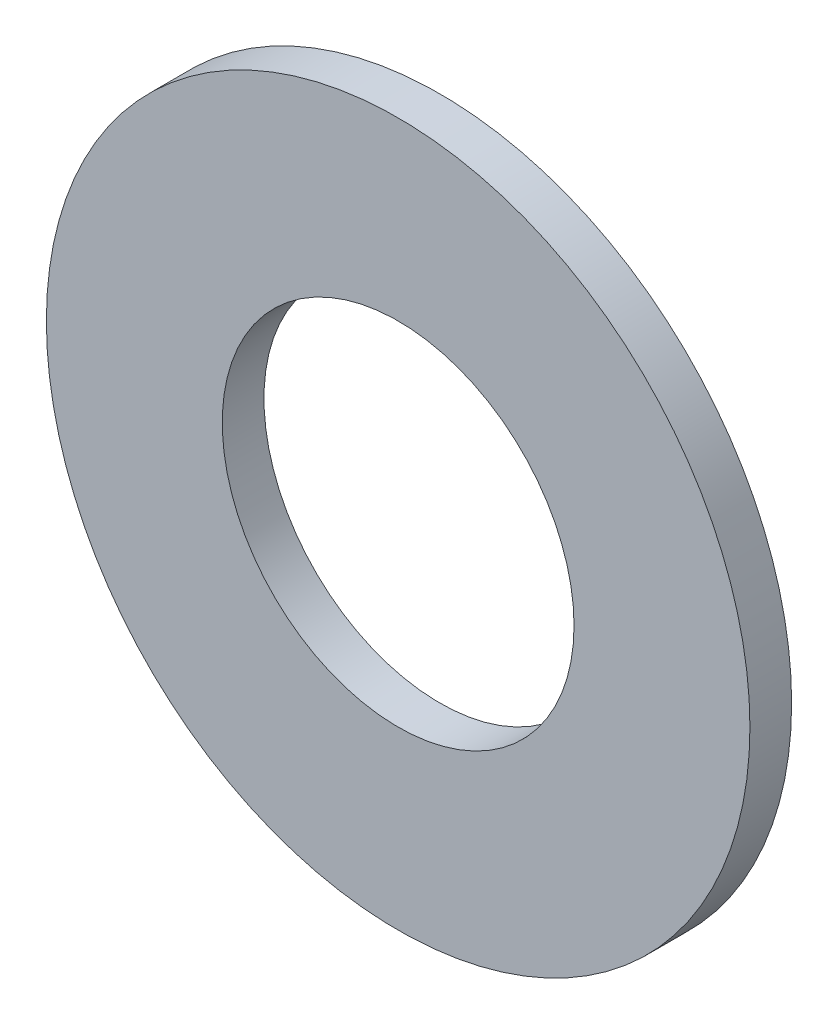
ISO-10303-21;
HEADER;
FILE_DESCRIPTION(('STEP AP214'),'2;1');
FILE_NAME('part.step','',(''),(''),'','','');
FILE_SCHEMA(('AUTOMOTIVE_DESIGN { 1 0 10303 214 1 1 1 1 }'));
ENDSEC;
DATA;
#1=APPLICATION_CONTEXT('core data for automotive mechanical design processes');
#2=APPLICATION_PROTOCOL_DEFINITION('international standard','automotive_design',2000,#1);
#3=PRODUCT_CONTEXT('',#1,'mechanical');
#4=PRODUCT('Part','Part','',(#3));
#5=PRODUCT_RELATED_PRODUCT_CATEGORY('part','',(#4));
#6=PRODUCT_DEFINITION_FORMATION('','',#4);
#7=PRODUCT_DEFINITION_CONTEXT('part definition',#1,'design');
#8=PRODUCT_DEFINITION('design','',#6,#7);
#9=PRODUCT_DEFINITION_SHAPE('','',#8);
#10=(LENGTH_UNIT() NAMED_UNIT(*) SI_UNIT(.MILLI.,.METRE.));
#11=(NAMED_UNIT(*) PLANE_ANGLE_UNIT() SI_UNIT($,.RADIAN.));
#12=(NAMED_UNIT(*) SI_UNIT($,.STERADIAN.) SOLID_ANGLE_UNIT());
#13=UNCERTAINTY_MEASURE_WITH_UNIT(LENGTH_MEASURE(1.E-05),#10,'distance_accuracy_value','');
#14=(GEOMETRIC_REPRESENTATION_CONTEXT(3) GLOBAL_UNCERTAINTY_ASSIGNED_CONTEXT((#13)) GLOBAL_UNIT_ASSIGNED_CONTEXT((#10,
#11,#12)) REPRESENTATION_CONTEXT('',''));
#15=CARTESIAN_POINT('',(0.,0.,0.));
#16=DIRECTION('',(0.,0.,1.));
#17=DIRECTION('',(1.,0.,0.));
#18=AXIS2_PLACEMENT_3D('',#15,#16,#17);
#19=CARTESIAN_POINT('',(0.,0.,0.));
#20=DIRECTION('',(0.,0.,-1.));
#21=DIRECTION('',(1.,0.,0.));
#22=AXIS2_PLACEMENT_3D('',#19,#20,#21);
#23=CYLINDRICAL_SURFACE('',#22,0.2999994);
#24=CARTESIAN_POINT('',(0.,0.,0.03556));
#25=DIRECTION('',(0.,0.,1.));
#26=DIRECTION('',(1.,0.,0.));
#27=AXIS2_PLACEMENT_3D('',#24,#25,#26);
#28=CIRCLE('',#27,0.2999994);
#29=CARTESIAN_POINT('',(0.2999994,0.,0.03556));
#30=VERTEX_POINT('',#29);
#31=EDGE_CURVE('E11',#30,#30,#28,.T.);
#32=ORIENTED_EDGE('',*,*,#31,.F.);
#33=DIRECTION('',(0.,0.,1.));
#34=VECTOR('',#33,1.);
#35=CARTESIAN_POINT('',(0.2999994,0.,0.));
#36=LINE('',#35,#34);
#37=CARTESIAN_POINT('',(0.2999994,0.,0.));
#38=VERTEX_POINT('',#37);
#39=EDGE_CURVE('E23',#38,#30,#36,.T.);
#40=ORIENTED_EDGE('',*,*,#39,.F.);
#41=CARTESIAN_POINT('',(0.,0.,0.));
#42=DIRECTION('',(0.,0.,1.));
#43=DIRECTION('',(1.,0.,0.));
#44=AXIS2_PLACEMENT_3D('',#41,#42,#43);
#45=CIRCLE('',#44,0.2999994);
#46=EDGE_CURVE('E45',#38,#38,#45,.T.);
#47=ORIENTED_EDGE('',*,*,#46,.T.);
#48=ORIENTED_EDGE('',*,*,#39,.T.);
#49=EDGE_LOOP('',(#32,#40,#47,#48));
#50=FACE_BOUND('',#49,.T.);
#51=ADVANCED_FACE('F16',(#50),#23,.T.);
#52=CARTESIAN_POINT('',(0.,0.,0.));
#53=DIRECTION('',(0.,0.,-1.));
#54=DIRECTION('',(1.,0.,0.));
#55=AXIS2_PLACEMENT_3D('',#52,#53,#54);
#56=CYLINDRICAL_SURFACE('',#55,0.1499997);
#57=DIRECTION('',(0.,0.,1.));
#58=VECTOR('',#57,1.);
#59=CARTESIAN_POINT('',(0.1499997,0.,0.));
#60=LINE('',#59,#58);
#61=CARTESIAN_POINT('',(0.1499997,0.,0.));
#62=VERTEX_POINT('',#61);
#63=CARTESIAN_POINT('',(0.1499997,0.,0.03556));
#64=VERTEX_POINT('',#63);
#65=EDGE_CURVE('E39',#62,#64,#60,.T.);
#66=ORIENTED_EDGE('',*,*,#65,.T.);
#67=CARTESIAN_POINT('',(0.,0.,0.03556));
#68=DIRECTION('',(0.,0.,1.));
#69=DIRECTION('',(1.,0.,0.));
#70=AXIS2_PLACEMENT_3D('',#67,#68,#69);
#71=CIRCLE('',#70,0.1499997);
#72=EDGE_CURVE('E44',#64,#64,#71,.T.);
#73=ORIENTED_EDGE('',*,*,#72,.T.);
#74=ORIENTED_EDGE('',*,*,#65,.F.);
#75=CARTESIAN_POINT('',(0.,0.,0.));
#76=DIRECTION('',(0.,0.,1.));
#77=DIRECTION('',(1.,0.,0.));
#78=AXIS2_PLACEMENT_3D('',#75,#76,#77);
#79=CIRCLE('',#78,0.1499997);
#80=EDGE_CURVE('E42',#62,#62,#79,.T.);
#81=ORIENTED_EDGE('',*,*,#80,.F.);
#82=EDGE_LOOP('',(#66,#73,#74,#81));
#83=FACE_BOUND('',#82,.T.);
#84=ADVANCED_FACE('F41',(#83),#56,.F.);
#85=CARTESIAN_POINT('',(0.,0.,0.));
#86=DIRECTION('',(0.,0.,1.));
#87=DIRECTION('',(1.,0.,0.));
#88=AXIS2_PLACEMENT_3D('',#85,#86,#87);
#89=PLANE('',#88);
#90=ORIENTED_EDGE('',*,*,#46,.F.);
#91=EDGE_LOOP('',(#90));
#92=FACE_BOUND('',#91,.T.);
#93=ORIENTED_EDGE('',*,*,#80,.T.);
#94=EDGE_LOOP('',(#93));
#95=FACE_BOUND('',#94,.T.);
#96=ADVANCED_FACE('F48',(#92,#95),#89,.F.);
#97=CARTESIAN_POINT('',(0.,0.,0.03556));
#98=DIRECTION('',(0.,0.,1.));
#99=DIRECTION('',(1.,0.,0.));
#100=AXIS2_PLACEMENT_3D('',#97,#98,#99);
#101=PLANE('',#100);
#102=ORIENTED_EDGE('',*,*,#31,.T.);
#103=EDGE_LOOP('',(#102));
#104=FACE_BOUND('',#103,.T.);
#105=ORIENTED_EDGE('',*,*,#72,.F.);
#106=EDGE_LOOP('',(#105));
#107=FACE_BOUND('',#106,.T.);
#108=ADVANCED_FACE('F55',(#104,#107),#101,.T.);
#109=CLOSED_SHELL('',(#51,#84,#96,#108));
#110=MANIFOLD_SOLID_BREP('B1',#109);
#111=ADVANCED_BREP_SHAPE_REPRESENTATION('',(#18,#110),#14);
#112=SHAPE_DEFINITION_REPRESENTATION(#9,#111);
ENDSEC;
END-ISO-10303-21;
